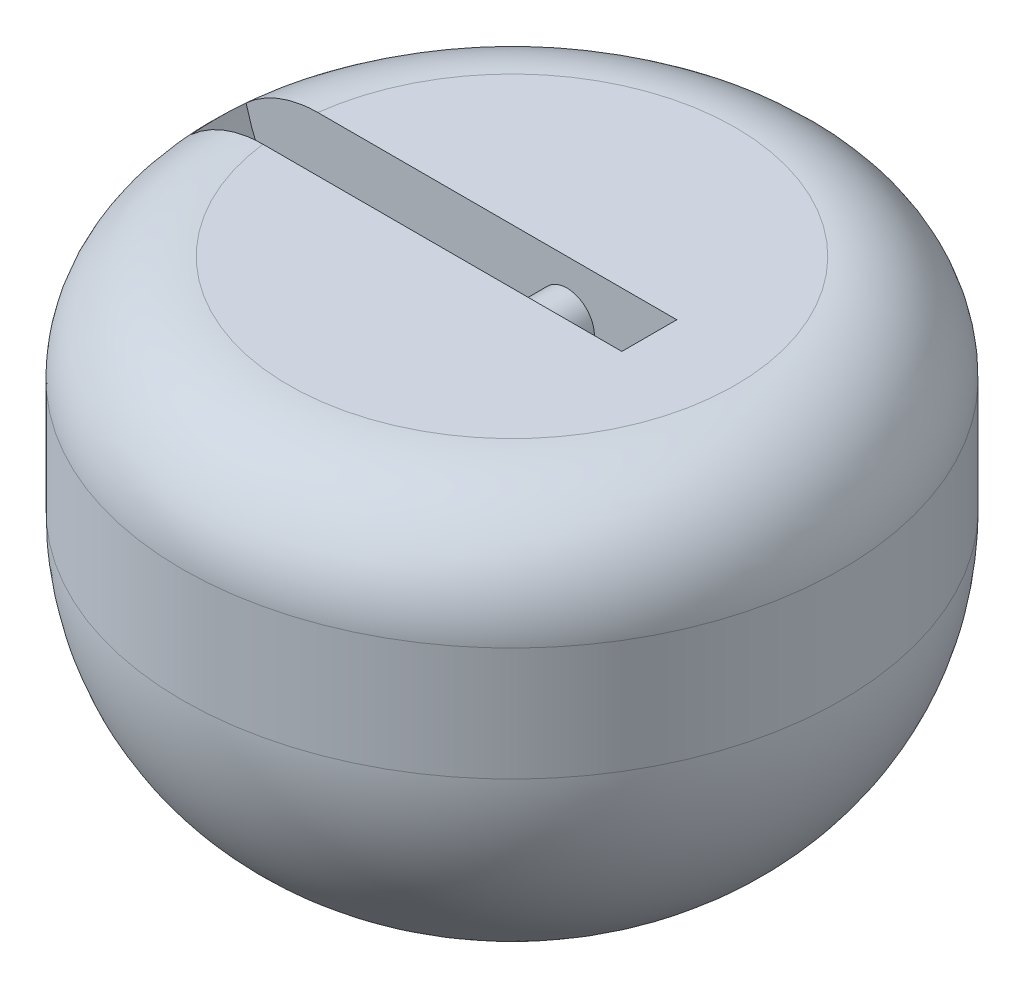
ISO-10303-21;
HEADER;
FILE_DESCRIPTION(('STEP AP214'),'2;1');
FILE_NAME('part.step','',(''),(''),'','','');
FILE_SCHEMA(('AUTOMOTIVE_DESIGN { 1 0 10303 214 1 1 1 1 }'));
ENDSEC;
DATA;
#1=APPLICATION_CONTEXT('core data for automotive mechanical design processes');
#2=APPLICATION_PROTOCOL_DEFINITION('international standard','automotive_design',2000,#1);
#3=PRODUCT_CONTEXT('',#1,'mechanical');
#4=PRODUCT('Part','Part','',(#3));
#5=PRODUCT_RELATED_PRODUCT_CATEGORY('part','',(#4));
#6=PRODUCT_DEFINITION_FORMATION('','',#4);
#7=PRODUCT_DEFINITION_CONTEXT('part definition',#1,'design');
#8=PRODUCT_DEFINITION('design','',#6,#7);
#9=PRODUCT_DEFINITION_SHAPE('','',#8);
#10=(LENGTH_UNIT() NAMED_UNIT(*) SI_UNIT(.MILLI.,.METRE.));
#11=(NAMED_UNIT(*) PLANE_ANGLE_UNIT() SI_UNIT($,.RADIAN.));
#12=(NAMED_UNIT(*) SI_UNIT($,.STERADIAN.) SOLID_ANGLE_UNIT());
#13=UNCERTAINTY_MEASURE_WITH_UNIT(LENGTH_MEASURE(1.E-05),#10,'distance_accuracy_value','');
#14=(GEOMETRIC_REPRESENTATION_CONTEXT(3) GLOBAL_UNCERTAINTY_ASSIGNED_CONTEXT((#13)) GLOBAL_UNIT_ASSIGNED_CONTEXT((#10,
#11,#12)) REPRESENTATION_CONTEXT('',''));
#15=CARTESIAN_POINT('',(0.,0.,0.));
#16=DIRECTION('',(0.,0.,1.));
#17=DIRECTION('',(1.,0.,0.));
#18=AXIS2_PLACEMENT_3D('',#15,#16,#17);
#19=CARTESIAN_POINT('',(-0.0725618988584568,-7.93967129493901,-4.20542377037249));
#20=DIRECTION('',(-1.,0.,0.));
#21=DIRECTION('',(0.,0.,-1.));
#22=AXIS2_PLACEMENT_3D('',#19,#20,#21);
#23=CIRCLE('',#22,19.7945762296437);
#24=TRIMMED_CURVE('',#23,(PARAMETER_VALUE(-1.784881256261)),(PARAMETER_VALUE(1.784881256261)),
.T.,.PARAMETER.);
#25=CARTESIAN_POINT('',(-0.0725618988584568,-7.93967129493901,-1.62171203399788E-11));
#26=DIRECTION('',(0.,-1.,0.));
#27=AXIS1_PLACEMENT('',#25,#26);
#28=SURFACE_OF_REVOLUTION('',#24,#27);
#29=CARTESIAN_POINT('',(-0.0725618988584568,-27.2823613618066,-1.62171203399788E-11));
#30=VERTEX_POINT('',#29);
#31=VERTEX_LOOP('',#30);
#32=FACE_BOUND('',#31,.T.);
#33=CARTESIAN_POINT('',(-0.0725618988584568,-7.93967129493901,-1.62171203399788E-11));
#34=DIRECTION('',(0.,-1.,0.));
#35=DIRECTION('',(0.,0.,-1.));
#36=AXIS2_PLACEMENT_3D('',#33,#34,#35);
#37=CIRCLE('',#36,24.);
#38=CARTESIAN_POINT('',(-0.0725618988584568,-7.93967129493901,-24.0000000000162));
#39=VERTEX_POINT('',#38);
#40=EDGE_CURVE('E96',#39,#39,#37,.T.);
#41=ORIENTED_EDGE('',*,*,#40,.T.);
#42=EDGE_LOOP('',(#41));
#43=FACE_BOUND('',#42,.T.);
#44=ADVANCED_FACE('F44',(#32,#43),#28,.T.);
#45=CARTESIAN_POINT('',(-0.0725618988584568,8.06032870506099,-1.62171203399788E-11));
#46=DIRECTION('',(0.,-1.,0.));
#47=DIRECTION('',(0.,0.,-1.));
#48=AXIS2_PLACEMENT_3D('',#45,#46,#47);
#49=PLANE('',#48);
#50=CARTESIAN_POINT('',(-0.0725618988584568,8.06032870506099,-1.62171203399788E-11));
#51=DIRECTION('',(0.,-1.,0.));
#52=DIRECTION('',(0.,0.,-1.));
#53=AXIS2_PLACEMENT_3D('',#50,#51,#52);
#54=CIRCLE('',#53,16.2618040105733);
#55=CARTESIAN_POINT('',(-16.2109096977861,8.06032870506099,-2.00000000001622));
#56=VERTEX_POINT('',#55);
#57=CARTESIAN_POINT('',(-16.2109096977861,8.06032870506099,1.99999999998378));
#58=VERTEX_POINT('',#57);
#59=EDGE_CURVE('E101',#56,#58,#54,.T.);
#60=ORIENTED_EDGE('',*,*,#59,.F.);
#61=DIRECTION('',(-1.,0.,0.));
#62=VECTOR('',#61,1.);
#63=CARTESIAN_POINT('',(-0.0725618988584568,8.06032870506099,-2.00000000001622));
#64=LINE('',#63,#62);
#65=CARTESIAN_POINT('',(9.92743810114154,8.06032870506099,-2.00000000001622));
#66=VERTEX_POINT('',#65);
#67=EDGE_CURVE('E82',#66,#56,#64,.T.);
#68=ORIENTED_EDGE('',*,*,#67,.F.);
#69=DIRECTION('',(0.,0.,1.));
#70=VECTOR('',#69,1.);
#71=CARTESIAN_POINT('',(9.92743810114154,8.06032870506099,-2.00000000001622));
#72=LINE('',#71,#70);
#73=CARTESIAN_POINT('',(9.92743810114154,8.06032870506099,1.99999999998378));
#74=VERTEX_POINT('',#73);
#75=EDGE_CURVE('E91',#66,#74,#72,.T.);
#76=ORIENTED_EDGE('',*,*,#75,.T.);
#77=DIRECTION('',(-1.,0.,0.));
#78=VECTOR('',#77,1.);
#79=CARTESIAN_POINT('',(-0.0725618988584568,8.06032870506099,1.99999999998378));
#80=LINE('',#79,#78);
#81=EDGE_CURVE('E88',#74,#58,#80,.T.);
#82=ORIENTED_EDGE('',*,*,#81,.T.);
#83=EDGE_LOOP('',(#60,#68,#76,#82));
#84=FACE_BOUND('',#83,.T.);
#85=ADVANCED_FACE('F99',(#84),#49,.F.);
#86=CARTESIAN_POINT('',(-0.0725618988584568,0.32213271563428,-1.62171203399788E-11));
#87=DIRECTION('',(0.,-1.,0.));
#88=DIRECTION('',(0.,0.,-1.));
#89=AXIS2_PLACEMENT_3D('',#86,#87,#88);
#90=TOROIDAL_SURFACE('',#89,16.2618040105733,7.73819598942671);
#91=CARTESIAN_POINT('',(-0.0725618988584568,0.32213271563428,-1.62171203399788E-11));
#92=DIRECTION('',(0.,-1.,0.));
#93=DIRECTION('',(0.,0.,-1.));
#94=AXIS2_PLACEMENT_3D('',#91,#92,#93);
#95=CIRCLE('',#94,24.);
#96=CARTESIAN_POINT('',(-0.0725618988584568,0.32213271563428,-24.0000000000162));
#97=VERTEX_POINT('',#96);
#98=EDGE_CURVE('E114',#97,#97,#95,.T.);
#99=ORIENTED_EDGE('',*,*,#98,.F.);
#100=EDGE_LOOP('',(#99));
#101=FACE_BOUND('',#100,.T.);
#102=CARTESIAN_POINT('',(-21.4377757591259,6.05557804975501,2.00039999998378));
#103=CARTESIAN_POINT('',(-21.4436523927621,6.07836221775834,1.66734543732842));
#104=CARTESIAN_POINT('',(-21.4480093327418,6.09536918001707,1.33387782169322));
#105=CARTESIAN_POINT('',(-21.4537796031999,6.11797021834574,0.666939799418121));
#106=CARTESIAN_POINT('',(-21.4551965441138,6.12357829252989,0.333469899700952));
#107=CARTESIAN_POINT('',(-21.4551965441138,6.12357829252989,-0.333469899733386));
#108=CARTESIAN_POINT('',(-21.4537796031999,6.11797021834574,-0.666939799450555));
#109=CARTESIAN_POINT('',(-21.4480093327418,6.09536918001707,-1.33387782172566));
#110=CARTESIAN_POINT('',(-21.4436523927621,6.07836221775834,-1.66734543736085));
#111=CARTESIAN_POINT('',(-21.4377757591259,6.05557804975501,-2.00040000001622));
#112=B_SPLINE_CURVE_WITH_KNOTS('',3,(#102,#103,#104,#105,#106,#107,#108,#109,#110,#111),
.UNSPECIFIED.,.F.,.F.,(4,2,2,2,4),(0.,1.00158656092485,2.00194240405333,3.00229824718182,
4.00388480810667),.UNSPECIFIED.);
#113=CARTESIAN_POINT('',(-21.4377828432378,6.05560545172621,1.99999999998378));
#114=VERTEX_POINT('',#113);
#115=CARTESIAN_POINT('',(-21.4377828432237,6.05560545172985,-2.00000000001622));
#116=VERTEX_POINT('',#115);
#117=EDGE_CURVE('E128',#114,#116,#112,.T.);
#118=ORIENTED_EDGE('',*,*,#117,.T.);
#119=CARTESIAN_POINT('',(-21.5069935449019,5.99238232539165,-2.00000000001622));
#120=CARTESIAN_POINT('',(-21.3464866357809,6.1407958794414,-2.00000000001622));
#121=CARTESIAN_POINT('',(-21.1797126913492,6.28239721182245,-2.00000000001622));
#122=CARTESIAN_POINT('',(-20.834749906813,6.55106038644265,-2.00000000001622));
#123=CARTESIAN_POINT('',(-20.6565579277062,6.67811820345285,-2.00000000001622));
#124=CARTESIAN_POINT('',(-20.2898919538463,6.91688217357935,-2.00000000001622));
#125=CARTESIAN_POINT('',(-20.1014067593608,7.02857111992465,-2.00000000001622));
#126=CARTESIAN_POINT('',(-19.7156869828836,7.23566033111248,-2.00000000001622));
#127=CARTESIAN_POINT('',(-19.5184522582886,7.33106033034844,-2.00000000001622));
#128=CARTESIAN_POINT('',(-19.1168019967412,7.50484988949574,-2.00000000001622));
#129=CARTESIAN_POINT('',(-18.9123919326996,7.58325210023031,-2.00000000001622));
#130=CARTESIAN_POINT('',(-18.4977059982088,7.72261015349162,-2.00000000001622));
#131=CARTESIAN_POINT('',(-18.2874300359844,7.78356572288788,-2.00000000001622));
#132=CARTESIAN_POINT('',(-17.8626007465583,7.88760592491294,-2.00000000001622));
#133=CARTESIAN_POINT('',(-17.6480493245263,7.93069833874478,-2.00000000001622));
#134=CARTESIAN_POINT('',(-17.2160191661993,7.99879163716719,-2.00000000001622));
#135=CARTESIAN_POINT('',(-16.9985394382919,8.02378622792663,-2.00000000001622));
#136=CARTESIAN_POINT('',(-16.5613282557251,8.05558491993662,-2.00000000001622));
#137=CARTESIAN_POINT('',(-16.3415911654443,8.06231153139684,-2.00000000001622));
#138=CARTESIAN_POINT('',(-15.902245638446,8.05733798751511,-2.00000000001622));
#139=CARTESIAN_POINT('',(-15.6826372791362,8.04563103083585,-2.00000000001622));
#140=CARTESIAN_POINT('',(-15.2452350484514,8.00389980666827,-2.00000000001622));
#141=CARTESIAN_POINT('',(-15.0274406540041,7.97388101899289,-2.00000000001622));
#142=CARTESIAN_POINT('',(-14.5950366352943,7.89575764632117,-2.00000000001622));
#143=CARTESIAN_POINT('',(-14.3804282403077,7.84764625985346,-2.00000000001622));
#144=CARTESIAN_POINT('',(-13.9545321099058,7.73331576753014,-2.00000000001622));
#145=CARTESIAN_POINT('',(-13.7432766699545,7.66697633785736,-2.00000000001622));
#146=CARTESIAN_POINT('',(-13.326975672442,7.51679058043079,-2.00000000001622));
#147=CARTESIAN_POINT('',(-13.1219329808569,7.43293630964431,-2.00000000001622));
#148=CARTESIAN_POINT('',(-12.7195850828755,7.24833914341898,-2.00000000001622));
#149=CARTESIAN_POINT('',(-12.5222802299462,7.14759547757354,-2.00000000001622));
#150=CARTESIAN_POINT('',(-12.1368898234508,6.92998373443512,-2.00000000001622));
#151=CARTESIAN_POINT('',(-11.948800170603,6.81312291658348,-2.00000000001622));
#152=CARTESIAN_POINT('',(-11.5820232289732,6.56334141573192,-2.00000000001622));
#153=CARTESIAN_POINT('',(-11.4033959344789,6.43033261891944,-2.00000000001622));
#154=CARTESIAN_POINT('',(-11.0580649063335,6.14977088283069,-2.00000000001622));
#155=CARTESIAN_POINT('',(-10.8913567055009,6.00222344235476,-2.00000000001622));
#156=CARTESIAN_POINT('',(-10.5709442145017,5.69349588104666,-2.00000000001622));
#157=CARTESIAN_POINT('',(-10.4172453875155,5.53231008916055,-2.00000000001622));
#158=CARTESIAN_POINT('',(-10.1241423912156,5.19753467323607,-2.00000000001622));
#159=CARTESIAN_POINT('',(-9.98473270505085,5.02394988054863,-2.00000000001622));
#160=CARTESIAN_POINT('',(-9.72169299107075,4.66616064027714,-2.00000000001622));
#161=CARTESIAN_POINT('',(-9.59800849656785,4.48199624505581,-2.00000000001622));
#162=CARTESIAN_POINT('',(-9.36687650093807,4.10383572105317,-2.00000000001622));
#163=CARTESIAN_POINT('',(-9.25942297622486,3.90984327549602,-2.00000000001622));
#164=CARTESIAN_POINT('',(-9.06159465682803,3.51331651095873,-2.00000000001622));
#165=CARTESIAN_POINT('',(-8.97122106026292,3.3107815939615,-2.00000000001622));
#166=CARTESIAN_POINT('',(-8.8083619352122,2.89864218257254,-2.00000000001622));
#167=CARTESIAN_POINT('',(-8.7358760596278,2.68903782544811,-2.00000000001622));
#168=CARTESIAN_POINT('',(-8.6107323178693,2.26856811763019,-2.00000000001622));
#169=CARTESIAN_POINT('',(-8.55770575897953,2.05781247170942,-2.00000000001622));
#170=CARTESIAN_POINT('',(-8.4699671738615,1.63252400770269,-2.00000000001622));
#171=CARTESIAN_POINT('',(-8.43525471206215,1.41799127957393,-2.00000000001622));
#172=CARTESIAN_POINT('',(-8.3844805822568,0.986760522326136,-2.00000000001622));
#173=CARTESIAN_POINT('',(-8.36841621453365,0.770062811218101,-2.00000000001622));
#174=CARTESIAN_POINT('',(-8.3550871543206,0.336090969557157,-2.00000000001622));
#175=CARTESIAN_POINT('',(-8.3578222062306,0.118816846881386,-2.00000000001622));
#176=CARTESIAN_POINT('',(-8.38178896788242,-0.309769941163164,-2.00000000001622));
#177=CARTESIAN_POINT('',(-8.40260064302337,-0.521106233210682,-2.00000000001622));
#178=CARTESIAN_POINT('',(-8.46197026865582,-0.94134405391816,-2.00000000001622));
#179=CARTESIAN_POINT('',(-8.50053424053857,-1.15024473177292,-2.00000000001622));
#180=CARTESIAN_POINT('',(-8.59504307104058,-1.56400117502689,-2.00000000001622));
#181=CARTESIAN_POINT('',(-8.65098220001937,-1.76885825019672,-2.00000000001622));
#182=CARTESIAN_POINT('',(-8.77977706969662,-2.17326501587849,-2.00000000001622));
#183=CARTESIAN_POINT('',(-8.85263914349677,-2.37281268820676,-2.00000000001622));
#184=CARTESIAN_POINT('',(-9.01494055499307,-2.76587199895678,-2.00000000001622));
#185=CARTESIAN_POINT('',(-9.10443759061074,-2.95935980279227,-2.00000000001622));
#186=CARTESIAN_POINT('',(-9.29914796349692,-3.33834450980393,-2.00000000001622));
#187=CARTESIAN_POINT('',(-9.404367030964,-3.52383846757694,-2.00000000001622));
#188=CARTESIAN_POINT('',(-9.62965303980127,-3.88550532891631,-2.00000000001622));
#189=CARTESIAN_POINT('',(-9.74971588849328,-4.06168078270677,-2.00000000001622));
#190=CARTESIAN_POINT('',(-10.0038710463806,-4.40370127102962,-2.00000000001622));
#191=CARTESIAN_POINT('',(-10.1379685947056,-4.56954241065864,-2.00000000001622));
#192=CARTESIAN_POINT('',(-10.4225868848222,-4.89362457235034,-2.00000000001622));
#193=CARTESIAN_POINT('',(-10.5734249889048,-5.05158697166802,-2.00000000001622));
#194=CARTESIAN_POINT('',(-10.8877415544389,-5.35450835936338,-2.00000000001622));
#195=CARTESIAN_POINT('',(-11.0512246818334,-5.49946250473728,-2.00000000001622));
#196=CARTESIAN_POINT('',(-11.3896087189899,-5.77532286204767,-2.00000000001622));
#197=CARTESIAN_POINT('',(-11.5645082489608,-5.90623076658105,-2.00000000001622));
#198=CARTESIAN_POINT('',(-11.9245331055002,-6.15314554560808,-2.00000000001622));
#199=CARTESIAN_POINT('',(-12.1096587451761,-6.26915196347955,-2.00000000001622));
#200=CARTESIAN_POINT('',(-12.4920554192139,-6.48729646287089,-2.00000000001622));
#201=CARTESIAN_POINT('',(-12.6894784326858,-6.5891682552985,-2.00000000001622));
#202=CARTESIAN_POINT('',(-13.0921875481603,-6.77596518649369,-2.00000000001622));
#203=CARTESIAN_POINT('',(-13.2974737520717,-6.86089010553722,-2.00000000001622));
#204=CARTESIAN_POINT('',(-13.7144674485875,-7.01317973725786,-2.00000000001622));
#205=CARTESIAN_POINT('',(-13.9261751377249,-7.0805439118723,-2.00000000001622));
#206=CARTESIAN_POINT('',(-14.3545059020701,-7.19720698636136,-2.00000000001622));
#207=CARTESIAN_POINT('',(-14.5711288582224,-7.24650632329995,-2.00000000001622));
#208=CARTESIAN_POINT('',(-15.0081782506112,-7.32673957317477,-2.00000000001622));
#209=CARTESIAN_POINT('',(-15.2286111553194,-7.35763826516235,-2.00000000001622));
#210=CARTESIAN_POINT('',(-15.6712246000636,-7.40066163776295,-2.00000000001622));
#211=CARTESIAN_POINT('',(-15.8934045028202,-7.41279287173022,-2.00000000001622));
#212=CARTESIAN_POINT('',(-16.338032051194,-7.41818045157226,-2.00000000001622));
#213=CARTESIAN_POINT('',(-16.5604797361123,-7.41143356812211,-2.00000000001622));
#214=CARTESIAN_POINT('',(-17.0039934173171,-7.37907132315539,-2.00000000001622));
#215=CARTESIAN_POINT('',(-17.2250594521646,-7.35345649062299,-2.00000000001622));
#216=CARTESIAN_POINT('',(-17.6629003511211,-7.28371832126873,-2.00000000001622));
#217=CARTESIAN_POINT('',(-17.8796929446902,-7.23970628118819,-2.00000000001622));
#218=CARTESIAN_POINT('',(-18.3087654240782,-7.13347180940636,-2.00000000001622));
#219=CARTESIAN_POINT('',(-18.5210454152466,-7.07124980332965,-2.00000000001622));
#220=CARTESIAN_POINT('',(-18.9395919761472,-6.92900127156891,-2.00000000001622));
#221=CARTESIAN_POINT('',(-19.145857590008,-6.84897193300381,-2.00000000001622));
#222=CARTESIAN_POINT('',(-19.5507661693201,-6.67169613782775,-2.00000000001622));
#223=CARTESIAN_POINT('',(-19.7494118254779,-6.57445582801296,-2.00000000001622));
#224=CARTESIAN_POINT('',(-20.1363539625819,-6.36415326708763,-2.00000000001622));
#225=CARTESIAN_POINT('',(-20.3247128092487,-6.2512057524593,-2.00000000001622));
#226=CARTESIAN_POINT('',(-20.6911898531551,-6.00977474261505,-2.00000000001622));
#227=CARTESIAN_POINT('',(-20.8693083253046,-5.88129166474977,-2.00000000001622));
#228=CARTESIAN_POINT('',(-21.2140156177398,-5.60969220529147,-2.00000000001622));
#229=CARTESIAN_POINT('',(-21.3806044554992,-5.46657584587668,-2.00000000001622));
#230=CARTESIAN_POINT('',(-21.7010360542847,-5.16672756010835,-2.00000000001622));
#231=CARTESIAN_POINT('',(-21.8548790857143,-5.00999592274892,-2.00000000001622));
#232=CARTESIAN_POINT('',(-22.1478838448761,-4.68493749167746,-2.00000000001622));
#233=CARTESIAN_POINT('',(-22.287122223842,-4.51667978503244,-2.00000000001622));
#234=CARTESIAN_POINT('',(-22.5508314166779,-4.16905761682901,-2.00000000001622));
#235=CARTESIAN_POINT('',(-22.6753074383001,-3.98969710622093,-2.00000000001622));
#236=CARTESIAN_POINT('',(-22.9086660675832,-3.62106042211423,-2.00000000001622));
#237=CARTESIAN_POINT('',(-23.017546001281,-3.43178255585586,-2.00000000001622));
#238=CARTESIAN_POINT('',(-23.2188936215923,-3.04469511287952,-2.00000000001622));
#239=CARTESIAN_POINT('',(-23.3113617018161,-2.84688574091663,-2.00000000001622));
#240=CARTESIAN_POINT('',(-23.478899368771,-2.44490681480809,-2.00000000001622));
#241=CARTESIAN_POINT('',(-23.5540331995494,-2.24076403399516,-2.00000000001622));
#242=CARTESIAN_POINT('',(-23.6868031155759,-1.82686923370844,-2.00000000001622));
#243=CARTESIAN_POINT('',(-23.7444395189066,-1.61711731627754,-2.00000000001622));
#244=CARTESIAN_POINT('',(-23.8418055580593,-1.19346868597824,-2.00000000001622));
#245=CARTESIAN_POINT('',(-23.8815328461493,-0.979571433522953,-2.00000000001622));
#246=CARTESIAN_POINT('',(-23.9427711674906,-0.54926080195226,-2.00000000001622));
#247=CARTESIAN_POINT('',(-23.9642885343536,-0.332848324230583,-2.00000000001622));
#248=CARTESIAN_POINT('',(-23.9889509119457,0.100604733719004,-2.00000000001622));
#249=CARTESIAN_POINT('',(-23.9921310347688,0.317643316864734,-2.00000000001622));
#250=CARTESIAN_POINT('',(-23.9801900827484,0.751211157658216,-2.00000000001622));
#251=CARTESIAN_POINT('',(-23.9650694596007,0.967740427744586,-2.00000000001622));
#252=CARTESIAN_POINT('',(-23.9166303450422,1.39881223304315,-2.00000000001622));
#253=CARTESIAN_POINT('',(-23.8833070050587,1.61335422342197,-2.00000000001622));
#254=CARTESIAN_POINT('',(-23.7987003520143,2.03886367197543,-2.00000000001622));
#255=CARTESIAN_POINT('',(-23.7474173006932,2.24983118219655,-2.00000000001622));
#256=CARTESIAN_POINT('',(-23.6272403705297,2.66676663019766,-2.00000000001622));
#257=CARTESIAN_POINT('',(-23.5583405371389,2.87273285169521,-2.00000000001622));
#258=CARTESIAN_POINT('',(-23.4034643032475,3.27805428678901,-2.00000000001622));
#259=CARTESIAN_POINT('',(-23.3174941382102,3.47741188344992,-2.00000000001622));
#260=CARTESIAN_POINT('',(-23.1291626543861,3.86800926847343,-2.00000000001622));
#261=CARTESIAN_POINT('',(-23.0268162316654,4.05925623626398,-2.00000000001622));
#262=CARTESIAN_POINT('',(-22.8064511757144,4.43241291326798,-2.00000000001622));
#263=CARTESIAN_POINT('',(-22.6884367263609,4.61432509725676,-2.00000000001622));
#264=CARTESIAN_POINT('',(-22.4083549435718,5.00869949363795,-2.00000000001622));
#265=CARTESIAN_POINT('',(-22.2424243387197,5.21843306698886,-2.00000000001622));
#266=CARTESIAN_POINT('',(-21.889777540362,5.61962691352815,-2.00000000001622));
#267=CARTESIAN_POINT('',(-21.7030613573035,5.81108719590085,-2.00000000001622));
#268=CARTESIAN_POINT('',(-21.5069935449019,5.99238232539165,-2.00000000001622));
#269=B_SPLINE_CURVE_WITH_KNOTS('',3,(#119,#120,#121,#122,#123,#124,#125,#126,#127,#128,#129,
#130,#131,#132,#133,#134,#135,#136,#137,#138,#139,#140,#141,#142,#143,#144,#145,#146,#147,#148,
#149,#150,#151,#152,#153,#154,#155,#156,#157,#158,#159,#160,#161,#162,#163,#164,#165,#166,#167,
#168,#169,#170,#171,#172,#173,#174,#175,#176,#177,#178,#179,#180,#181,#182,#183,#184,#185,#186,
#187,#188,#189,#190,#191,#192,#193,#194,#195,#196,#197,#198,#199,#200,#201,#202,#203,#204,#205,
#206,#207,#208,#209,#210,#211,#212,#213,#214,#215,#216,#217,#218,#219,#220,#221,#222,#223,#224,
#225,#226,#227,#228,#229,#230,#231,#232,#233,#234,#235,#236,#237,#238,#239,#240,#241,#242,#243,
#244,#245,#246,#247,#248,#249,#250,#251,#252,#253,#254,#255,#256,#257,#258,#259,#260,#261,#262,
#263,#264,#265,#266,#267,#268),.UNSPECIFIED.,.T.,.F.,(4,2,2,2,2,2,2,2,2,2,2,2,2,2,2,2,2,2,2,2,2,
2,2,2,2,2,2,2,2,2,2,2,2,2,2,2,2,2,2,2,2,2,2,2,2,2,2,2,2,2,2,2,2,2,2,2,2,2,2,2,2,2,2,2,2,2,2,2,2,
2,2,2,2,2,4),(0.,0.655585768146928,1.31135254716968,1.96784764157611,2.62435343972896,
3.28036893472672,3.93639469920915,4.59213439735548,5.24810203094214,5.90684785797588,
6.56583679597489,7.22462862829793,7.88366836532029,8.54716752261831,9.21096823462674,
9.87479923402267,10.5383322031621,11.2056639558322,11.8727442723378,12.5401033481069,
13.2072037869227,13.8719267348,14.5364023834777,15.2009246263397,15.8654339735951,
16.5166088871598,17.167768312887,17.8188334573656,18.4698897498697,19.1062107305339,
19.7427477037575,20.3790749946802,21.0156408042121,21.6544571827891,22.2935069608437,
22.9323809335134,23.5714942531938,24.2259748421025,24.8806980934761,25.5353423607251,
26.1900066832764,26.855689975159,27.521381897373,28.1870942140459,28.8527904232908,
29.5197567897727,30.1864902075928,30.8533376850096,31.5201664673188,32.1830182501561,
32.8458545412842,33.5087956097526,34.171500388758,34.8295963967524,35.4876747294433,
36.1457520647647,36.8038154353306,37.4582311823772,38.1124153785433,38.7667116012634,
39.4209921296829,40.072807353772,40.7246107279242,41.3764995230996,42.028161490856,
42.6785752430025,43.3289729420713,43.9795439690742,44.6301055152354,45.2808872453638,
45.9314316933302,46.5813877264573,47.231170547799,48.0320041861223,48.8328374219376),.UNSPECIFIED.);
#270=EDGE_CURVE('E84',#116,#56,#269,.T.);
#271=ORIENTED_EDGE('',*,*,#270,.T.);
#272=ORIENTED_EDGE('',*,*,#59,.T.);
#273=CARTESIAN_POINT('',(-21.5069935449019,5.99238232539165,1.99999999998378));
#274=CARTESIAN_POINT('',(-21.3464866357809,6.1407958794414,1.99999999998378));
#275=CARTESIAN_POINT('',(-21.1797126913492,6.28239721182245,1.99999999998378));
#276=CARTESIAN_POINT('',(-20.834749906813,6.55106038644265,1.99999999998378));
#277=CARTESIAN_POINT('',(-20.6565579277062,6.67811820345285,1.99999999998378));
#278=CARTESIAN_POINT('',(-20.2898919538463,6.91688217357935,1.99999999998378));
#279=CARTESIAN_POINT('',(-20.1014067593608,7.02857111992465,1.99999999998378));
#280=CARTESIAN_POINT('',(-19.7156869828836,7.23566033111248,1.99999999998378));
#281=CARTESIAN_POINT('',(-19.5184522582886,7.33106033034844,1.99999999998378));
#282=CARTESIAN_POINT('',(-19.1168019967412,7.50484988949574,1.99999999998378));
#283=CARTESIAN_POINT('',(-18.9123919326996,7.58325210023031,1.99999999998378));
#284=CARTESIAN_POINT('',(-18.4977059982088,7.72261015349162,1.99999999998378));
#285=CARTESIAN_POINT('',(-18.2874300359844,7.78356572288788,1.99999999998378));
#286=CARTESIAN_POINT('',(-17.8626007465583,7.88760592491294,1.99999999998378));
#287=CARTESIAN_POINT('',(-17.6480493245263,7.93069833874478,1.99999999998378));
#288=CARTESIAN_POINT('',(-17.2160191661993,7.99879163716719,1.99999999998378));
#289=CARTESIAN_POINT('',(-16.9985394382919,8.02378622792663,1.99999999998378));
#290=CARTESIAN_POINT('',(-16.5613282557251,8.05558491993662,1.99999999998378));
#291=CARTESIAN_POINT('',(-16.3415911654443,8.06231153139684,1.99999999998378));
#292=CARTESIAN_POINT('',(-15.902245638446,8.05733798751511,1.99999999998378));
#293=CARTESIAN_POINT('',(-15.6826372791362,8.04563103083585,1.99999999998378));
#294=CARTESIAN_POINT('',(-15.2452350484514,8.00389980666827,1.99999999998378));
#295=CARTESIAN_POINT('',(-15.0274406540041,7.97388101899289,1.99999999998378));
#296=CARTESIAN_POINT('',(-14.5950366352943,7.89575764632117,1.99999999998378));
#297=CARTESIAN_POINT('',(-14.3804282403077,7.84764625985346,1.99999999998378));
#298=CARTESIAN_POINT('',(-13.9545321099058,7.73331576753014,1.99999999998378));
#299=CARTESIAN_POINT('',(-13.7432766699545,7.66697633785736,1.99999999998378));
#300=CARTESIAN_POINT('',(-13.326975672442,7.51679058043079,1.99999999998378));
#301=CARTESIAN_POINT('',(-13.1219329808569,7.43293630964431,1.99999999998378));
#302=CARTESIAN_POINT('',(-12.7195850828755,7.24833914341898,1.99999999998378));
#303=CARTESIAN_POINT('',(-12.5222802299462,7.14759547757354,1.99999999998378));
#304=CARTESIAN_POINT('',(-12.1368898234508,6.92998373443512,1.99999999998378));
#305=CARTESIAN_POINT('',(-11.948800170603,6.81312291658348,1.99999999998378));
#306=CARTESIAN_POINT('',(-11.5820232289732,6.56334141573192,1.99999999998378));
#307=CARTESIAN_POINT('',(-11.4033959344789,6.43033261891944,1.99999999998378));
#308=CARTESIAN_POINT('',(-11.0580649063335,6.14977088283069,1.99999999998378));
#309=CARTESIAN_POINT('',(-10.8913567055009,6.00222344235476,1.99999999998378));
#310=CARTESIAN_POINT('',(-10.5709442145017,5.69349588104666,1.99999999998378));
#311=CARTESIAN_POINT('',(-10.4172453875155,5.53231008916055,1.99999999998378));
#312=CARTESIAN_POINT('',(-10.1241423912156,5.19753467323607,1.99999999998378));
#313=CARTESIAN_POINT('',(-9.98473270505085,5.02394988054863,1.99999999998378));
#314=CARTESIAN_POINT('',(-9.72169299107075,4.66616064027714,1.99999999998378));
#315=CARTESIAN_POINT('',(-9.59800849656785,4.48199624505581,1.99999999998378));
#316=CARTESIAN_POINT('',(-9.36687650093807,4.10383572105317,1.99999999998378));
#317=CARTESIAN_POINT('',(-9.25942297622486,3.90984327549602,1.99999999998378));
#318=CARTESIAN_POINT('',(-9.06159465682803,3.51331651095873,1.99999999998378));
#319=CARTESIAN_POINT('',(-8.97122106026292,3.3107815939615,1.99999999998378));
#320=CARTESIAN_POINT('',(-8.8083619352122,2.89864218257254,1.99999999998378));
#321=CARTESIAN_POINT('',(-8.7358760596278,2.68903782544811,1.99999999998378));
#322=CARTESIAN_POINT('',(-8.6107323178693,2.26856811763019,1.99999999998378));
#323=CARTESIAN_POINT('',(-8.55770575897953,2.05781247170942,1.99999999998378));
#324=CARTESIAN_POINT('',(-8.4699671738615,1.63252400770269,1.99999999998378));
#325=CARTESIAN_POINT('',(-8.43525471206215,1.41799127957393,1.99999999998378));
#326=CARTESIAN_POINT('',(-8.3844805822568,0.986760522326136,1.99999999998378));
#327=CARTESIAN_POINT('',(-8.36841621453365,0.770062811218101,1.99999999998378));
#328=CARTESIAN_POINT('',(-8.3550871543206,0.336090969557157,1.99999999998378));
#329=CARTESIAN_POINT('',(-8.3578222062306,0.118816846881386,1.99999999998378));
#330=CARTESIAN_POINT('',(-8.38178896788242,-0.309769941163164,1.99999999998378));
#331=CARTESIAN_POINT('',(-8.40260064302337,-0.521106233210682,1.99999999998378));
#332=CARTESIAN_POINT('',(-8.46197026865582,-0.94134405391816,1.99999999998378));
#333=CARTESIAN_POINT('',(-8.50053424053857,-1.15024473177292,1.99999999998378));
#334=CARTESIAN_POINT('',(-8.59504307104058,-1.56400117502689,1.99999999998378));
#335=CARTESIAN_POINT('',(-8.65098220001937,-1.76885825019672,1.99999999998378));
#336=CARTESIAN_POINT('',(-8.77977706969662,-2.17326501587849,1.99999999998378));
#337=CARTESIAN_POINT('',(-8.85263914349677,-2.37281268820676,1.99999999998378));
#338=CARTESIAN_POINT('',(-9.01494055499307,-2.76587199895678,1.99999999998378));
#339=CARTESIAN_POINT('',(-9.10443759061074,-2.95935980279227,1.99999999998378));
#340=CARTESIAN_POINT('',(-9.29914796349692,-3.33834450980393,1.99999999998378));
#341=CARTESIAN_POINT('',(-9.404367030964,-3.52383846757694,1.99999999998378));
#342=CARTESIAN_POINT('',(-9.62965303980127,-3.88550532891631,1.99999999998378));
#343=CARTESIAN_POINT('',(-9.74971588849328,-4.06168078270677,1.99999999998378));
#344=CARTESIAN_POINT('',(-10.0038710463806,-4.40370127102962,1.99999999998378));
#345=CARTESIAN_POINT('',(-10.1379685947056,-4.56954241065864,1.99999999998378));
#346=CARTESIAN_POINT('',(-10.4225868848222,-4.89362457235034,1.99999999998378));
#347=CARTESIAN_POINT('',(-10.5734249889048,-5.05158697166802,1.99999999998378));
#348=CARTESIAN_POINT('',(-10.8877415544389,-5.35450835936338,1.99999999998378));
#349=CARTESIAN_POINT('',(-11.0512246818334,-5.49946250473728,1.99999999998378));
#350=CARTESIAN_POINT('',(-11.3896087189899,-5.77532286204767,1.99999999998378));
#351=CARTESIAN_POINT('',(-11.5645082489608,-5.90623076658105,1.99999999998378));
#352=CARTESIAN_POINT('',(-11.9245331055002,-6.15314554560808,1.99999999998378));
#353=CARTESIAN_POINT('',(-12.1096587451761,-6.26915196347955,1.99999999998378));
#354=CARTESIAN_POINT('',(-12.4920554192139,-6.48729646287089,1.99999999998378));
#355=CARTESIAN_POINT('',(-12.6894784326858,-6.5891682552985,1.99999999998378));
#356=CARTESIAN_POINT('',(-13.0921875481603,-6.77596518649369,1.99999999998378));
#357=CARTESIAN_POINT('',(-13.2974737520717,-6.86089010553722,1.99999999998378));
#358=CARTESIAN_POINT('',(-13.7144674485875,-7.01317973725786,1.99999999998378));
#359=CARTESIAN_POINT('',(-13.9261751377249,-7.0805439118723,1.99999999998378));
#360=CARTESIAN_POINT('',(-14.3545059020701,-7.19720698636136,1.99999999998378));
#361=CARTESIAN_POINT('',(-14.5711288582224,-7.24650632329995,1.99999999998378));
#362=CARTESIAN_POINT('',(-15.0081782506112,-7.32673957317477,1.99999999998378));
#363=CARTESIAN_POINT('',(-15.2286111553194,-7.35763826516235,1.99999999998378));
#364=CARTESIAN_POINT('',(-15.6712246000636,-7.40066163776295,1.99999999998378));
#365=CARTESIAN_POINT('',(-15.8934045028202,-7.41279287173022,1.99999999998378));
#366=CARTESIAN_POINT('',(-16.338032051194,-7.41818045157226,1.99999999998378));
#367=CARTESIAN_POINT('',(-16.5604797361123,-7.41143356812211,1.99999999998378));
#368=CARTESIAN_POINT('',(-17.0039934173171,-7.37907132315539,1.99999999998378));
#369=CARTESIAN_POINT('',(-17.2250594521646,-7.35345649062299,1.99999999998378));
#370=CARTESIAN_POINT('',(-17.6629003511211,-7.28371832126873,1.99999999998378));
#371=CARTESIAN_POINT('',(-17.8796929446902,-7.23970628118819,1.99999999998378));
#372=CARTESIAN_POINT('',(-18.3087654240782,-7.13347180940636,1.99999999998378));
#373=CARTESIAN_POINT('',(-18.5210454152466,-7.07124980332965,1.99999999998378));
#374=CARTESIAN_POINT('',(-18.9395919761472,-6.92900127156891,1.99999999998378));
#375=CARTESIAN_POINT('',(-19.145857590008,-6.84897193300381,1.99999999998378));
#376=CARTESIAN_POINT('',(-19.5507661693201,-6.67169613782775,1.99999999998378));
#377=CARTESIAN_POINT('',(-19.7494118254779,-6.57445582801296,1.99999999998378));
#378=CARTESIAN_POINT('',(-20.1363539625819,-6.36415326708763,1.99999999998378));
#379=CARTESIAN_POINT('',(-20.3247128092487,-6.2512057524593,1.99999999998378));
#380=CARTESIAN_POINT('',(-20.6911898531551,-6.00977474261505,1.99999999998378));
#381=CARTESIAN_POINT('',(-20.8693083253046,-5.88129166474977,1.99999999998378));
#382=CARTESIAN_POINT('',(-21.2140156177398,-5.60969220529147,1.99999999998378));
#383=CARTESIAN_POINT('',(-21.3806044554992,-5.46657584587668,1.99999999998378));
#384=CARTESIAN_POINT('',(-21.7010360542847,-5.16672756010835,1.99999999998378));
#385=CARTESIAN_POINT('',(-21.8548790857143,-5.00999592274892,1.99999999998378));
#386=CARTESIAN_POINT('',(-22.1478838448761,-4.68493749167746,1.99999999998378));
#387=CARTESIAN_POINT('',(-22.287122223842,-4.51667978503244,1.99999999998378));
#388=CARTESIAN_POINT('',(-22.5508314166779,-4.16905761682901,1.99999999998378));
#389=CARTESIAN_POINT('',(-22.6753074383001,-3.98969710622093,1.99999999998378));
#390=CARTESIAN_POINT('',(-22.9086660675832,-3.62106042211423,1.99999999998378));
#391=CARTESIAN_POINT('',(-23.017546001281,-3.43178255585586,1.99999999998378));
#392=CARTESIAN_POINT('',(-23.2188936215923,-3.04469511287952,1.99999999998378));
#393=CARTESIAN_POINT('',(-23.3113617018161,-2.84688574091663,1.99999999998378));
#394=CARTESIAN_POINT('',(-23.478899368771,-2.44490681480809,1.99999999998378));
#395=CARTESIAN_POINT('',(-23.5540331995494,-2.24076403399516,1.99999999998378));
#396=CARTESIAN_POINT('',(-23.6868031155759,-1.82686923370844,1.99999999998378));
#397=CARTESIAN_POINT('',(-23.7444395189066,-1.61711731627754,1.99999999998378));
#398=CARTESIAN_POINT('',(-23.8418055580593,-1.19346868597824,1.99999999998378));
#399=CARTESIAN_POINT('',(-23.8815328461493,-0.979571433522953,1.99999999998378));
#400=CARTESIAN_POINT('',(-23.9427711674906,-0.54926080195226,1.99999999998378));
#401=CARTESIAN_POINT('',(-23.9642885343536,-0.332848324230583,1.99999999998378));
#402=CARTESIAN_POINT('',(-23.9889509119457,0.100604733719004,1.99999999998378));
#403=CARTESIAN_POINT('',(-23.9921310347688,0.317643316864734,1.99999999998378));
#404=CARTESIAN_POINT('',(-23.9801900827484,0.751211157658216,1.99999999998378));
#405=CARTESIAN_POINT('',(-23.9650694596007,0.967740427744586,1.99999999998378));
#406=CARTESIAN_POINT('',(-23.9166303450422,1.39881223304315,1.99999999998378));
#407=CARTESIAN_POINT('',(-23.8833070050587,1.61335422342197,1.99999999998378));
#408=CARTESIAN_POINT('',(-23.7987003520143,2.03886367197543,1.99999999998378));
#409=CARTESIAN_POINT('',(-23.7474173006932,2.24983118219655,1.99999999998378));
#410=CARTESIAN_POINT('',(-23.6272403705297,2.66676663019766,1.99999999998378));
#411=CARTESIAN_POINT('',(-23.5583405371389,2.87273285169521,1.99999999998378));
#412=CARTESIAN_POINT('',(-23.4034643032475,3.27805428678901,1.99999999998378));
#413=CARTESIAN_POINT('',(-23.3174941382102,3.47741188344992,1.99999999998378));
#414=CARTESIAN_POINT('',(-23.1291626543861,3.86800926847343,1.99999999998378));
#415=CARTESIAN_POINT('',(-23.0268162316654,4.05925623626398,1.99999999998378));
#416=CARTESIAN_POINT('',(-22.8064511757144,4.43241291326798,1.99999999998378));
#417=CARTESIAN_POINT('',(-22.6884367263609,4.61432509725676,1.99999999998378));
#418=CARTESIAN_POINT('',(-22.4083549435718,5.00869949363795,1.99999999998378));
#419=CARTESIAN_POINT('',(-22.2424243387197,5.21843306698886,1.99999999998378));
#420=CARTESIAN_POINT('',(-21.889777540362,5.61962691352815,1.99999999998378));
#421=CARTESIAN_POINT('',(-21.7030613573035,5.81108719590085,1.99999999998378));
#422=CARTESIAN_POINT('',(-21.5069935449019,5.99238232539165,1.99999999998378));
#423=B_SPLINE_CURVE_WITH_KNOTS('',3,(#273,#274,#275,#276,#277,#278,#279,#280,#281,#282,#283,
#284,#285,#286,#287,#288,#289,#290,#291,#292,#293,#294,#295,#296,#297,#298,#299,#300,#301,#302,
#303,#304,#305,#306,#307,#308,#309,#310,#311,#312,#313,#314,#315,#316,#317,#318,#319,#320,#321,
#322,#323,#324,#325,#326,#327,#328,#329,#330,#331,#332,#333,#334,#335,#336,#337,#338,#339,#340,
#341,#342,#343,#344,#345,#346,#347,#348,#349,#350,#351,#352,#353,#354,#355,#356,#357,#358,#359,
#360,#361,#362,#363,#364,#365,#366,#367,#368,#369,#370,#371,#372,#373,#374,#375,#376,#377,#378,
#379,#380,#381,#382,#383,#384,#385,#386,#387,#388,#389,#390,#391,#392,#393,#394,#395,#396,#397,
#398,#399,#400,#401,#402,#403,#404,#405,#406,#407,#408,#409,#410,#411,#412,#413,#414,#415,#416,
#417,#418,#419,#420,#421,#422),.UNSPECIFIED.,.T.,.F.,(4,2,2,2,2,2,2,2,2,2,2,2,2,2,2,2,2,2,2,2,2,
2,2,2,2,2,2,2,2,2,2,2,2,2,2,2,2,2,2,2,2,2,2,2,2,2,2,2,2,2,2,2,2,2,2,2,2,2,2,2,2,2,2,2,2,2,2,2,2,
2,2,2,2,2,4),(0.,0.655585768146928,1.31135254716968,1.96784764157611,2.62435343972896,
3.28036893472672,3.93639469920915,4.59213439735548,5.24810203094214,5.90684785797588,
6.56583679597489,7.22462862829793,7.88366836532029,8.54716752261831,9.21096823462674,
9.87479923402267,10.5383322031621,11.2056639558322,11.8727442723378,12.5401033481069,
13.2072037869227,13.8719267348,14.5364023834777,15.2009246263397,15.8654339735951,
16.5166088871598,17.167768312887,17.8188334573656,18.4698897498697,19.1062107305339,
19.7427477037575,20.3790749946802,21.0156408042121,21.6544571827891,22.2935069608437,
22.9323809335134,23.5714942531938,24.2259748421025,24.8806980934761,25.5353423607251,
26.1900066832764,26.855689975159,27.521381897373,28.1870942140459,28.8527904232908,
29.5197567897727,30.1864902075928,30.8533376850096,31.5201664673188,32.1830182501561,
32.8458545412842,33.5087956097526,34.171500388758,34.8295963967524,35.4876747294433,
36.1457520647647,36.8038154353306,37.4582311823772,38.1124153785433,38.7667116012634,
39.4209921296829,40.072807353772,40.7246107279242,41.3764995230996,42.028161490856,
42.6785752430025,43.3289729420713,43.9795439690742,44.6301055152354,45.2808872453638,
45.9314316933302,46.5813877264573,47.231170547799,48.0320041861223,48.8328374219376),.UNSPECIFIED.);
#424=EDGE_CURVE('E120',#114,#58,#423,.T.);
#425=ORIENTED_EDGE('',*,*,#424,.F.);
#426=EDGE_LOOP('',(#118,#271,#272,#425));
#427=FACE_BOUND('',#426,.T.);
#428=ADVANCED_FACE('F135',(#101,#427),#90,.T.);
#429=CARTESIAN_POINT('',(-0.0725618988584568,-27.2823613618066,-1.62171203399788E-11));
#430=DIRECTION('',(0.,-1.,0.));
#431=DIRECTION('',(0.,0.,-1.));
#432=AXIS2_PLACEMENT_3D('',#429,#430,#431);
#433=CYLINDRICAL_SURFACE('',#432,24.);
#434=ORIENTED_EDGE('',*,*,#40,.F.);
#435=EDGE_LOOP('',(#434));
#436=FACE_BOUND('',#435,.T.);
#437=ORIENTED_EDGE('',*,*,#98,.T.);
#438=EDGE_LOOP('',(#437));
#439=FACE_BOUND('',#438,.T.);
#440=ADVANCED_FACE('F148',(#436,#439),#433,.T.);
#441=CARTESIAN_POINT('',(-5.947069765246,10.060328705061,-2.00000000001622));
#442=DIRECTION('',(0.,0.,1.));
#443=DIRECTION('',(1.,0.,0.));
#444=AXIS2_PLACEMENT_3D('',#441,#442,#443);
#445=CYLINDRICAL_SURFACE('',#444,16.);
#446=CARTESIAN_POINT('',(-5.947069765246,10.060328705061,1.99999999998378));
#447=DIRECTION('',(0.,0.,1.));
#448=DIRECTION('',(-1.,0.,0.));
#449=AXIS2_PLACEMENT_3D('',#446,#447,#448);
#450=CIRCLE('',#449,16.);
#451=EDGE_CURVE('E59',#114,#74,#450,.T.);
#452=ORIENTED_EDGE('',*,*,#451,.T.);
#453=ORIENTED_EDGE('',*,*,#75,.F.);
#454=CARTESIAN_POINT('',(-5.947069765246,10.060328705061,-2.00000000001622));
#455=DIRECTION('',(0.,0.,1.));
#456=DIRECTION('',(-1.,0.,0.));
#457=AXIS2_PLACEMENT_3D('',#454,#455,#456);
#458=CIRCLE('',#457,16.);
#459=EDGE_CURVE('E78',#116,#66,#458,.T.);
#460=ORIENTED_EDGE('',*,*,#459,.F.);
#461=ORIENTED_EDGE('',*,*,#117,.F.);
#462=EDGE_LOOP('',(#452,#453,#460,#461));
#463=FACE_BOUND('',#462,.T.);
#464=ADVANCED_FACE('F92',(#463),#445,.F.);
#465=CARTESIAN_POINT('',(-5.947069765246,10.060328705061,-2.00000000001622));
#466=DIRECTION('',(0.,0.,-1.));
#467=DIRECTION('',(-1.,0.,0.));
#468=AXIS2_PLACEMENT_3D('',#465,#466,#467);
#469=PLANE('',#468);
#470=CARTESIAN_POINT('',(-6.07256189885846,-1.93967129493901,-2.00000000001622));
#471=DIRECTION('',(0.,0.,-1.));
#472=DIRECTION('',(-1.,0.,0.));
#473=AXIS2_PLACEMENT_3D('',#470,#471,#472);
#474=CIRCLE('',#473,2.);
#475=CARTESIAN_POINT('',(-8.07256189885846,-1.93967129493901,-2.00000000001622));
#476=VERTEX_POINT('',#475);
#477=EDGE_CURVE('E11',#476,#476,#474,.F.);
#478=ORIENTED_EDGE('',*,*,#477,.F.);
#479=EDGE_LOOP('',(#478));
#480=FACE_BOUND('',#479,.T.);
#481=CARTESIAN_POINT('',(1.92743810114154,4.06032870506099,-2.00000000001622));
#482=DIRECTION('',(0.,0.,-1.));
#483=DIRECTION('',(-1.,0.,0.));
#484=AXIS2_PLACEMENT_3D('',#481,#482,#483);
#485=CIRCLE('',#484,2.);
#486=CARTESIAN_POINT('',(-0.0725618988584573,4.06032870506099,-2.00000000001622));
#487=VERTEX_POINT('',#486);
#488=EDGE_CURVE('E52',#487,#487,#485,.F.);
#489=ORIENTED_EDGE('',*,*,#488,.F.);
#490=EDGE_LOOP('',(#489));
#491=FACE_BOUND('',#490,.T.);
#492=ORIENTED_EDGE('',*,*,#459,.T.);
#493=ORIENTED_EDGE('',*,*,#67,.T.);
#494=ORIENTED_EDGE('',*,*,#270,.F.);
#495=EDGE_LOOP('',(#492,#493,#494));
#496=FACE_BOUND('',#495,.T.);
#497=ADVANCED_FACE('F80',(#480,#491,#496),#469,.F.);
#498=CARTESIAN_POINT('',(-5.947069765246,10.060328705061,1.99999999998378));
#499=DIRECTION('',(0.,0.,-1.));
#500=DIRECTION('',(-1.,0.,0.));
#501=AXIS2_PLACEMENT_3D('',#498,#499,#500);
#502=PLANE('',#501);
#503=CARTESIAN_POINT('',(-6.07256189885846,-1.93967129493901,1.99999999998378));
#504=DIRECTION('',(0.,0.,1.));
#505=DIRECTION('',(1.,0.,0.));
#506=AXIS2_PLACEMENT_3D('',#503,#504,#505);
#507=CIRCLE('',#506,2.);
#508=CARTESIAN_POINT('',(-4.07256189885846,-1.93967129493901,1.99999999998378));
#509=VERTEX_POINT('',#508);
#510=EDGE_CURVE('E218',#509,#509,#507,.T.);
#511=ORIENTED_EDGE('',*,*,#510,.T.);
#512=EDGE_LOOP('',(#511));
#513=FACE_BOUND('',#512,.T.);
#514=CARTESIAN_POINT('',(1.92743810114154,4.06032870506099,1.99999999998378));
#515=DIRECTION('',(0.,0.,1.));
#516=DIRECTION('',(1.,0.,0.));
#517=AXIS2_PLACEMENT_3D('',#514,#515,#516);
#518=CIRCLE('',#517,2.);
#519=CARTESIAN_POINT('',(3.92743810114154,4.06032870506099,1.99999999998378));
#520=VERTEX_POINT('',#519);
#521=EDGE_CURVE('E108',#520,#520,#518,.T.);
#522=ORIENTED_EDGE('',*,*,#521,.T.);
#523=EDGE_LOOP('',(#522));
#524=FACE_BOUND('',#523,.T.);
#525=ORIENTED_EDGE('',*,*,#424,.T.);
#526=ORIENTED_EDGE('',*,*,#81,.F.);
#527=ORIENTED_EDGE('',*,*,#451,.F.);
#528=EDGE_LOOP('',(#525,#526,#527));
#529=FACE_BOUND('',#528,.T.);
#530=ADVANCED_FACE('F138',(#513,#524,#529),#502,.T.);
#531=CARTESIAN_POINT('',(1.92743810114154,4.06032870506099,1.99999999998378));
#532=DIRECTION('',(0.,0.,-1.));
#533=DIRECTION('',(-1.,0.,0.));
#534=AXIS2_PLACEMENT_3D('',#531,#532,#533);
#535=CYLINDRICAL_SURFACE('',#534,2.);
#536=ORIENTED_EDGE('',*,*,#521,.F.);
#537=EDGE_LOOP('',(#536));
#538=FACE_BOUND('',#537,.T.);
#539=ORIENTED_EDGE('',*,*,#488,.T.);
#540=EDGE_LOOP('',(#539));
#541=FACE_BOUND('',#540,.T.);
#542=ADVANCED_FACE('F142',(#538,#541),#535,.T.);
#543=CARTESIAN_POINT('',(-6.07256189885846,-1.93967129493901,1.99999999998378));
#544=DIRECTION('',(0.,0.,-1.));
#545=DIRECTION('',(-1.,0.,0.));
#546=AXIS2_PLACEMENT_3D('',#543,#544,#545);
#547=CYLINDRICAL_SURFACE('',#546,2.);
#548=ORIENTED_EDGE('',*,*,#510,.F.);
#549=EDGE_LOOP('',(#548));
#550=FACE_BOUND('',#549,.T.);
#551=ORIENTED_EDGE('',*,*,#477,.T.);
#552=EDGE_LOOP('',(#551));
#553=FACE_BOUND('',#552,.T.);
#554=ADVANCED_FACE('F203',(#550,#553),#547,.T.);
#555=CLOSED_SHELL('',(#44,#85,#428,#440,#464,#497,#530,#542,#554));
#556=MANIFOLD_SOLID_BREP('B2',#555);
#557=ADVANCED_BREP_SHAPE_REPRESENTATION('',(#18,#556),#14);
#558=SHAPE_DEFINITION_REPRESENTATION(#9,#557);
ENDSEC;
END-ISO-10303-21;
